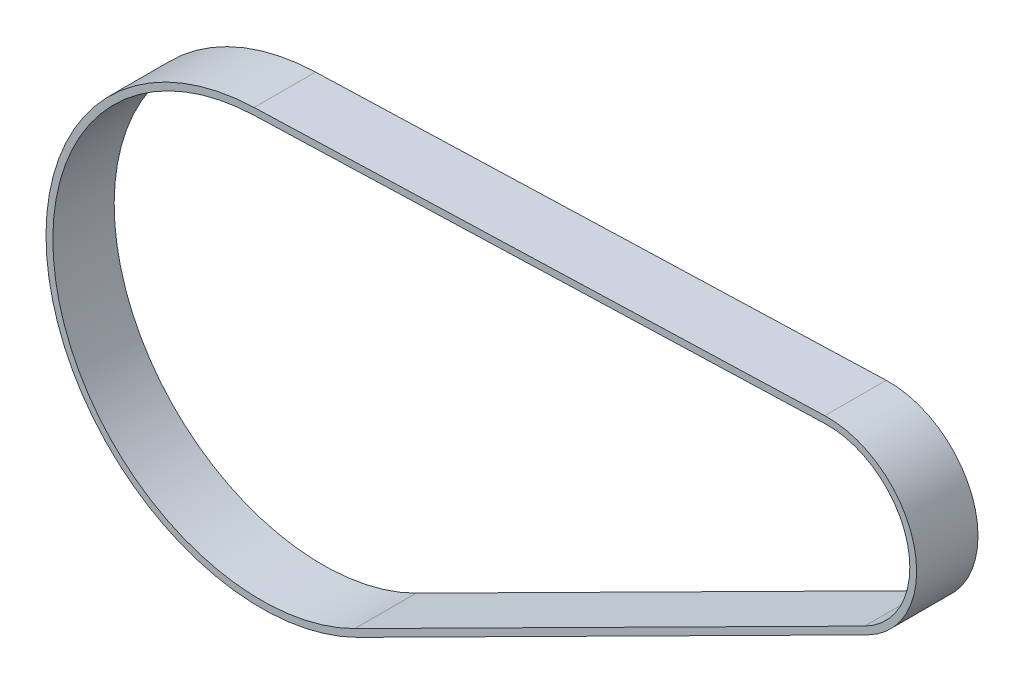
ISO-10303-21;
HEADER;
FILE_DESCRIPTION(('STEP AP214'),'2;1');
FILE_NAME('part.step','',(''),(''),'','','');
FILE_SCHEMA(('AUTOMOTIVE_DESIGN { 1 0 10303 214 1 1 1 1 }'));
ENDSEC;
DATA;
#1=APPLICATION_CONTEXT('core data for automotive mechanical design processes');
#2=APPLICATION_PROTOCOL_DEFINITION('international standard','automotive_design',2000,#1);
#3=PRODUCT_CONTEXT('',#1,'mechanical');
#4=PRODUCT('Part','Part','',(#3));
#5=PRODUCT_RELATED_PRODUCT_CATEGORY('part','',(#4));
#6=PRODUCT_DEFINITION_FORMATION('','',#4);
#7=PRODUCT_DEFINITION_CONTEXT('part definition',#1,'design');
#8=PRODUCT_DEFINITION('design','',#6,#7);
#9=PRODUCT_DEFINITION_SHAPE('','',#8);
#10=(LENGTH_UNIT() NAMED_UNIT(*) SI_UNIT(.MILLI.,.METRE.));
#11=(NAMED_UNIT(*) PLANE_ANGLE_UNIT() SI_UNIT($,.RADIAN.));
#12=(NAMED_UNIT(*) SI_UNIT($,.STERADIAN.) SOLID_ANGLE_UNIT());
#13=UNCERTAINTY_MEASURE_WITH_UNIT(LENGTH_MEASURE(1.E-05),#10,'distance_accuracy_value','');
#14=(GEOMETRIC_REPRESENTATION_CONTEXT(3) GLOBAL_UNCERTAINTY_ASSIGNED_CONTEXT((#13)) GLOBAL_UNIT_ASSIGNED_CONTEXT((#10,
#11,#12)) REPRESENTATION_CONTEXT('',''));
#15=CARTESIAN_POINT('',(0.,0.,0.));
#16=DIRECTION('',(0.,0.,1.));
#17=DIRECTION('',(1.,0.,0.));
#18=AXIS2_PLACEMENT_3D('',#15,#16,#17);
#19=CARTESIAN_POINT('',(0.,0.,-4.5));
#20=DIRECTION('',(0.,0.,1.));
#21=DIRECTION('',(1.,0.,0.));
#22=AXIS2_PLACEMENT_3D('',#19,#20,#21);
#23=CYLINDRICAL_SURFACE('',#22,31.55);
#24=DIRECTION('',(0.,0.,1.));
#25=VECTOR('',#24,1.);
#26=CARTESIAN_POINT('',(14.2053585387414,-28.1710895917394,-4.5));
#27=LINE('',#26,#25);
#28=CARTESIAN_POINT('',(14.2053585387414,-28.1710895917394,-4.5));
#29=VERTEX_POINT('',#28);
#30=CARTESIAN_POINT('',(14.2053585387414,-28.1710895917394,4.5));
#31=VERTEX_POINT('',#30);
#32=EDGE_CURVE('E88',#29,#31,#27,.T.);
#33=ORIENTED_EDGE('',*,*,#32,.T.);
#34=CARTESIAN_POINT('',(0.,0.,4.5));
#35=DIRECTION('',(0.,0.,-1.));
#36=DIRECTION('',(-1.,0.,0.));
#37=AXIS2_PLACEMENT_3D('',#34,#35,#36);
#38=CIRCLE('',#37,31.55);
#39=CARTESIAN_POINT('',(-1.01777157780874,31.5335795782116,4.5));
#40=VERTEX_POINT('',#39);
#41=EDGE_CURVE('E180',#40,#31,#38,.F.);
#42=ORIENTED_EDGE('',*,*,#41,.F.);
#43=DIRECTION('',(0.,0.,1.));
#44=VECTOR('',#43,1.);
#45=CARTESIAN_POINT('',(-1.01777157780874,31.5335795782116,-4.5));
#46=LINE('',#45,#44);
#47=CARTESIAN_POINT('',(-1.01777157780874,31.5335795782116,-4.5));
#48=VERTEX_POINT('',#47);
#49=EDGE_CURVE('E12',#48,#40,#46,.T.);
#50=ORIENTED_EDGE('',*,*,#49,.F.);
#51=CARTESIAN_POINT('',(0.,0.,-4.5));
#52=DIRECTION('',(0.,0.,-1.));
#53=DIRECTION('',(-1.,0.,0.));
#54=AXIS2_PLACEMENT_3D('',#51,#52,#53);
#55=CIRCLE('',#54,31.55);
#56=EDGE_CURVE('E199',#48,#29,#55,.F.);
#57=ORIENTED_EDGE('',*,*,#56,.T.);
#58=EDGE_LOOP('',(#33,#42,#50,#57));
#59=FACE_BOUND('',#58,.T.);
#60=ADVANCED_FACE('F85',(#59),#23,.T.);
#61=CARTESIAN_POINT('',(-1.01777157780874,31.5335795782116,-4.5));
#62=DIRECTION('',(-0.0322590040509902,0.999479542891018,0.));
#63=DIRECTION('',(-0.999479542891018,-0.0322590040509902,0.));
#64=AXIS2_PLACEMENT_3D('',#61,#62,#63);
#65=PLANE('',#64);
#66=ORIENTED_EDGE('',*,*,#49,.T.);
#67=DIRECTION('',(-0.999479542891018,-0.0322590040509902,0.));
#68=VECTOR('',#67,1.);
#69=CARTESIAN_POINT('',(-1.01777157780874,31.5335795782116,4.5));
#70=LINE('',#69,#68);
#71=CARTESIAN_POINT('',(82.6943979876766,34.235457006657,4.5));
#72=VERTEX_POINT('',#71);
#73=EDGE_CURVE('E189',#72,#40,#70,.T.);
#74=ORIENTED_EDGE('',*,*,#73,.F.);
#75=DIRECTION('',(0.,0.,1.));
#76=VECTOR('',#75,1.);
#77=CARTESIAN_POINT('',(82.6943979876766,34.235457006657,-4.5));
#78=LINE('',#77,#76);
#79=CARTESIAN_POINT('',(82.6943979876766,34.235457006657,-4.5));
#80=VERTEX_POINT('',#79);
#81=EDGE_CURVE('E93',#80,#72,#78,.T.);
#82=ORIENTED_EDGE('',*,*,#81,.F.);
#83=DIRECTION('',(-0.999479542891018,-0.0322590040509902,0.));
#84=VECTOR('',#83,1.);
#85=CARTESIAN_POINT('',(-1.01777157780874,31.5335795782116,-4.5));
#86=LINE('',#85,#84);
#87=EDGE_CURVE('E210',#80,#48,#86,.T.);
#88=ORIENTED_EDGE('',*,*,#87,.T.);
#89=EDGE_LOOP('',(#66,#74,#82,#88));
#90=FACE_BOUND('',#89,.T.);
#91=ADVANCED_FACE('F222',(#90),#65,.T.);
#92=CARTESIAN_POINT('',(83.115377990542,21.1922489719292,-4.5));
#93=DIRECTION('',(0.,0.,1.));
#94=DIRECTION('',(1.,0.,0.));
#95=AXIS2_PLACEMENT_3D('',#92,#93,#94);
#96=CYLINDRICAL_SURFACE('',#95,13.05);
#97=ORIENTED_EDGE('',*,*,#81,.T.);
#98=CARTESIAN_POINT('',(83.115377990542,21.1922489719292,4.5));
#99=DIRECTION('',(0.,0.,-1.));
#100=DIRECTION('',(-1.,0.,0.));
#101=AXIS2_PLACEMENT_3D('',#98,#99,#100);
#102=CIRCLE('',#101,13.05);
#103=CARTESIAN_POINT('',(88.991128511321,9.53986484602752,4.5));
#104=VERTEX_POINT('',#103);
#105=EDGE_CURVE('E186',#104,#72,#102,.F.);
#106=ORIENTED_EDGE('',*,*,#105,.F.);
#107=DIRECTION('',(0.,0.,1.));
#108=VECTOR('',#107,1.);
#109=CARTESIAN_POINT('',(88.991128511321,9.53986484602752,-4.5));
#110=LINE('',#109,#108);
#111=CARTESIAN_POINT('',(88.991128511321,9.53986484602752,-4.5));
#112=VERTEX_POINT('',#111);
#113=EDGE_CURVE('E213',#112,#104,#110,.T.);
#114=ORIENTED_EDGE('',*,*,#113,.F.);
#115=CARTESIAN_POINT('',(83.115377990542,21.1922489719292,-4.5));
#116=DIRECTION('',(0.,0.,-1.));
#117=DIRECTION('',(-1.,0.,0.));
#118=AXIS2_PLACEMENT_3D('',#115,#116,#117);
#119=CIRCLE('',#118,13.05);
#120=EDGE_CURVE('E207',#112,#80,#119,.F.);
#121=ORIENTED_EDGE('',*,*,#120,.T.);
#122=EDGE_LOOP('',(#97,#106,#114,#121));
#123=FACE_BOUND('',#122,.T.);
#124=ADVANCED_FACE('F228',(#123),#96,.T.);
#125=CARTESIAN_POINT('',(14.2053585387414,-28.1710895917394,-4.5));
#126=DIRECTION('',(0.450249082052025,-0.892902998153388,0.));
#127=DIRECTION('',(0.892902998153388,0.450249082052025,0.));
#128=AXIS2_PLACEMENT_3D('',#125,#126,#127);
#129=PLANE('',#128);
#130=ORIENTED_EDGE('',*,*,#113,.T.);
#131=DIRECTION('',(0.892902998153388,0.450249082052025,0.));
#132=VECTOR('',#131,1.);
#133=CARTESIAN_POINT('',(14.2053585387414,-28.1710895917394,4.5));
#134=LINE('',#133,#132);
#135=EDGE_CURVE('E183',#31,#104,#134,.T.);
#136=ORIENTED_EDGE('',*,*,#135,.F.);
#137=ORIENTED_EDGE('',*,*,#32,.F.);
#138=DIRECTION('',(0.892902998153388,0.450249082052025,0.));
#139=VECTOR('',#138,1.);
#140=CARTESIAN_POINT('',(14.2053585387414,-28.1710895917394,-4.5));
#141=LINE('',#140,#139);
#142=EDGE_CURVE('E204',#29,#112,#141,.T.);
#143=ORIENTED_EDGE('',*,*,#142,.T.);
#144=EDGE_LOOP('',(#130,#136,#137,#143));
#145=FACE_BOUND('',#144,.T.);
#146=ADVANCED_FACE('F217',(#145),#129,.T.);
#147=CARTESIAN_POINT('',(0.,0.,-4.5));
#148=DIRECTION('',(0.,0.,-1.));
#149=DIRECTION('',(-1.,0.,0.));
#150=AXIS2_PLACEMENT_3D('',#147,#148,#149);
#151=PLANE('',#150);
#152=CARTESIAN_POINT('',(0.,0.,-4.5));
#153=DIRECTION('',(0.,0.,1.));
#154=DIRECTION('',(-1.,0.,0.));
#155=AXIS2_PLACEMENT_3D('',#152,#153,#154);
#156=CIRCLE('',#155,30.55);
#157=CARTESIAN_POINT('',(-0.985512573757749,30.5341000353206,-4.5));
#158=VERTEX_POINT('',#157);
#159=CARTESIAN_POINT('',(13.7551094566894,-27.278186593586,-4.5));
#160=VERTEX_POINT('',#159);
#161=EDGE_CURVE('E192',#158,#160,#156,.T.);
#162=ORIENTED_EDGE('',*,*,#161,.T.);
#163=DIRECTION('',(0.892902998153388,0.450249082052025,0.));
#164=VECTOR('',#163,1.);
#165=CARTESIAN_POINT('',(88.5408794292689,10.4327678441809,-4.5));
#166=LINE('',#165,#164);
#167=CARTESIAN_POINT('',(88.5408794292689,10.4327678441809,-4.5));
#168=VERTEX_POINT('',#167);
#169=EDGE_CURVE('E157',#160,#168,#166,.T.);
#170=ORIENTED_EDGE('',*,*,#169,.T.);
#171=CARTESIAN_POINT('',(83.115377990542,21.1922489719292,-4.5));
#172=DIRECTION('',(0.,0.,1.));
#173=DIRECTION('',(-1.,0.,0.));
#174=AXIS2_PLACEMENT_3D('',#171,#172,#173);
#175=CIRCLE('',#174,12.05);
#176=CARTESIAN_POINT('',(82.7266569917276,33.235977463766,-4.5));
#177=VERTEX_POINT('',#176);
#178=EDGE_CURVE('E101',#168,#177,#175,.T.);
#179=ORIENTED_EDGE('',*,*,#178,.T.);
#180=DIRECTION('',(-0.999479542891018,-0.0322590040509902,0.));
#181=VECTOR('',#180,1.);
#182=CARTESIAN_POINT('',(-0.985512573757749,30.5341000353206,-4.5));
#183=LINE('',#182,#181);
#184=EDGE_CURVE('E162',#177,#158,#183,.T.);
#185=ORIENTED_EDGE('',*,*,#184,.T.);
#186=EDGE_LOOP('',(#162,#170,#179,#185));
#187=FACE_BOUND('',#186,.T.);
#188=ORIENTED_EDGE('',*,*,#56,.F.);
#189=ORIENTED_EDGE('',*,*,#87,.F.);
#190=ORIENTED_EDGE('',*,*,#120,.F.);
#191=ORIENTED_EDGE('',*,*,#142,.F.);
#192=EDGE_LOOP('',(#188,#189,#190,#191));
#193=FACE_BOUND('',#192,.T.);
#194=ADVANCED_FACE('F226',(#187,#193),#151,.T.);
#195=CARTESIAN_POINT('',(0.,0.,-4.5));
#196=DIRECTION('',(0.,0.,1.));
#197=DIRECTION('',(1.,0.,0.));
#198=AXIS2_PLACEMENT_3D('',#195,#196,#197);
#199=CYLINDRICAL_SURFACE('',#198,30.55);
#200=DIRECTION('',(0.,0.,1.));
#201=VECTOR('',#200,1.);
#202=CARTESIAN_POINT('',(-0.985512573757749,30.5341000353206,-4.5));
#203=LINE('',#202,#201);
#204=CARTESIAN_POINT('',(-0.985512573757749,30.5341000353206,4.5));
#205=VERTEX_POINT('',#204);
#206=EDGE_CURVE('E167',#158,#205,#203,.T.);
#207=ORIENTED_EDGE('',*,*,#206,.T.);
#208=CARTESIAN_POINT('',(0.,0.,4.5));
#209=DIRECTION('',(0.,0.,1.));
#210=DIRECTION('',(-1.,0.,0.));
#211=AXIS2_PLACEMENT_3D('',#208,#209,#210);
#212=CIRCLE('',#211,30.55);
#213=CARTESIAN_POINT('',(13.7551094566894,-27.278186593586,4.5));
#214=VERTEX_POINT('',#213);
#215=EDGE_CURVE('E165',#205,#214,#212,.T.);
#216=ORIENTED_EDGE('',*,*,#215,.T.);
#217=DIRECTION('',(0.,0.,1.));
#218=VECTOR('',#217,1.);
#219=CARTESIAN_POINT('',(13.7551094566894,-27.278186593586,-4.5));
#220=LINE('',#219,#218);
#221=EDGE_CURVE('E150',#160,#214,#220,.T.);
#222=ORIENTED_EDGE('',*,*,#221,.F.);
#223=ORIENTED_EDGE('',*,*,#161,.F.);
#224=EDGE_LOOP('',(#207,#216,#222,#223));
#225=FACE_BOUND('',#224,.T.);
#226=ADVANCED_FACE('F166',(#225),#199,.F.);
#227=CARTESIAN_POINT('',(-0.985512573757749,30.5341000353206,-4.5));
#228=DIRECTION('',(-0.0322590040509902,0.999479542891018,0.));
#229=DIRECTION('',(-0.999479542891018,-0.0322590040509902,0.));
#230=AXIS2_PLACEMENT_3D('',#227,#228,#229);
#231=PLANE('',#230);
#232=DIRECTION('',(0.,0.,1.));
#233=VECTOR('',#232,1.);
#234=CARTESIAN_POINT('',(82.7266569917276,33.235977463766,-4.5));
#235=LINE('',#234,#233);
#236=CARTESIAN_POINT('',(82.7266569917276,33.235977463766,4.5));
#237=VERTEX_POINT('',#236);
#238=EDGE_CURVE('E200',#177,#237,#235,.T.);
#239=ORIENTED_EDGE('',*,*,#238,.T.);
#240=DIRECTION('',(-0.999479542891018,-0.0322590040509902,0.));
#241=VECTOR('',#240,1.);
#242=CARTESIAN_POINT('',(-0.985512573757749,30.5341000353206,4.5));
#243=LINE('',#242,#241);
#244=EDGE_CURVE('E176',#237,#205,#243,.T.);
#245=ORIENTED_EDGE('',*,*,#244,.T.);
#246=ORIENTED_EDGE('',*,*,#206,.F.);
#247=ORIENTED_EDGE('',*,*,#184,.F.);
#248=EDGE_LOOP('',(#239,#245,#246,#247));
#249=FACE_BOUND('',#248,.T.);
#250=ADVANCED_FACE('F271',(#249),#231,.F.);
#251=CARTESIAN_POINT('',(83.115377990542,21.1922489719292,-4.5));
#252=DIRECTION('',(0.,0.,1.));
#253=DIRECTION('',(1.,0.,0.));
#254=AXIS2_PLACEMENT_3D('',#251,#252,#253);
#255=CYLINDRICAL_SURFACE('',#254,12.05);
#256=DIRECTION('',(0.,0.,1.));
#257=VECTOR('',#256,1.);
#258=CARTESIAN_POINT('',(88.5408794292689,10.4327678441809,-4.5));
#259=LINE('',#258,#257);
#260=CARTESIAN_POINT('',(88.5408794292689,10.4327678441809,4.5));
#261=VERTEX_POINT('',#260);
#262=EDGE_CURVE('E161',#168,#261,#259,.T.);
#263=ORIENTED_EDGE('',*,*,#262,.T.);
#264=CARTESIAN_POINT('',(83.115377990542,21.1922489719292,4.5));
#265=DIRECTION('',(0.,0.,1.));
#266=DIRECTION('',(-1.,0.,0.));
#267=AXIS2_PLACEMENT_3D('',#264,#265,#266);
#268=CIRCLE('',#267,12.05);
#269=EDGE_CURVE('E174',#261,#237,#268,.T.);
#270=ORIENTED_EDGE('',*,*,#269,.T.);
#271=ORIENTED_EDGE('',*,*,#238,.F.);
#272=ORIENTED_EDGE('',*,*,#178,.F.);
#273=EDGE_LOOP('',(#263,#270,#271,#272));
#274=FACE_BOUND('',#273,.T.);
#275=ADVANCED_FACE('F280',(#274),#255,.F.);
#276=CARTESIAN_POINT('',(88.5408794292689,10.4327678441809,-4.5));
#277=DIRECTION('',(0.450249082052025,-0.892902998153388,0.));
#278=DIRECTION('',(0.892902998153388,0.450249082052025,0.));
#279=AXIS2_PLACEMENT_3D('',#276,#277,#278);
#280=PLANE('',#279);
#281=ORIENTED_EDGE('',*,*,#221,.T.);
#282=DIRECTION('',(0.892902998153388,0.450249082052025,0.));
#283=VECTOR('',#282,1.);
#284=CARTESIAN_POINT('',(88.5408794292689,10.4327678441809,4.5));
#285=LINE('',#284,#283);
#286=EDGE_CURVE('E154',#214,#261,#285,.T.);
#287=ORIENTED_EDGE('',*,*,#286,.T.);
#288=ORIENTED_EDGE('',*,*,#262,.F.);
#289=ORIENTED_EDGE('',*,*,#169,.F.);
#290=EDGE_LOOP('',(#281,#287,#288,#289));
#291=FACE_BOUND('',#290,.T.);
#292=ADVANCED_FACE('F152',(#291),#280,.F.);
#293=CARTESIAN_POINT('',(0.,0.,4.5));
#294=DIRECTION('',(0.,0.,-1.));
#295=DIRECTION('',(-1.,0.,0.));
#296=AXIS2_PLACEMENT_3D('',#293,#294,#295);
#297=PLANE('',#296);
#298=ORIENTED_EDGE('',*,*,#41,.T.);
#299=ORIENTED_EDGE('',*,*,#135,.T.);
#300=ORIENTED_EDGE('',*,*,#105,.T.);
#301=ORIENTED_EDGE('',*,*,#73,.T.);
#302=EDGE_LOOP('',(#298,#299,#300,#301));
#303=FACE_BOUND('',#302,.T.);
#304=ORIENTED_EDGE('',*,*,#215,.F.);
#305=ORIENTED_EDGE('',*,*,#244,.F.);
#306=ORIENTED_EDGE('',*,*,#269,.F.);
#307=ORIENTED_EDGE('',*,*,#286,.F.);
#308=EDGE_LOOP('',(#304,#305,#306,#307));
#309=FACE_BOUND('',#308,.T.);
#310=ADVANCED_FACE('F172',(#303,#309),#297,.F.);
#311=CLOSED_SHELL('',(#60,#91,#124,#146,#194,#226,#250,#275,#292,#310));
#312=MANIFOLD_SOLID_BREP('B2',#311);
#313=ADVANCED_BREP_SHAPE_REPRESENTATION('',(#18,#312),#14);
#314=SHAPE_DEFINITION_REPRESENTATION(#9,#313);
ENDSEC;
END-ISO-10303-21;
